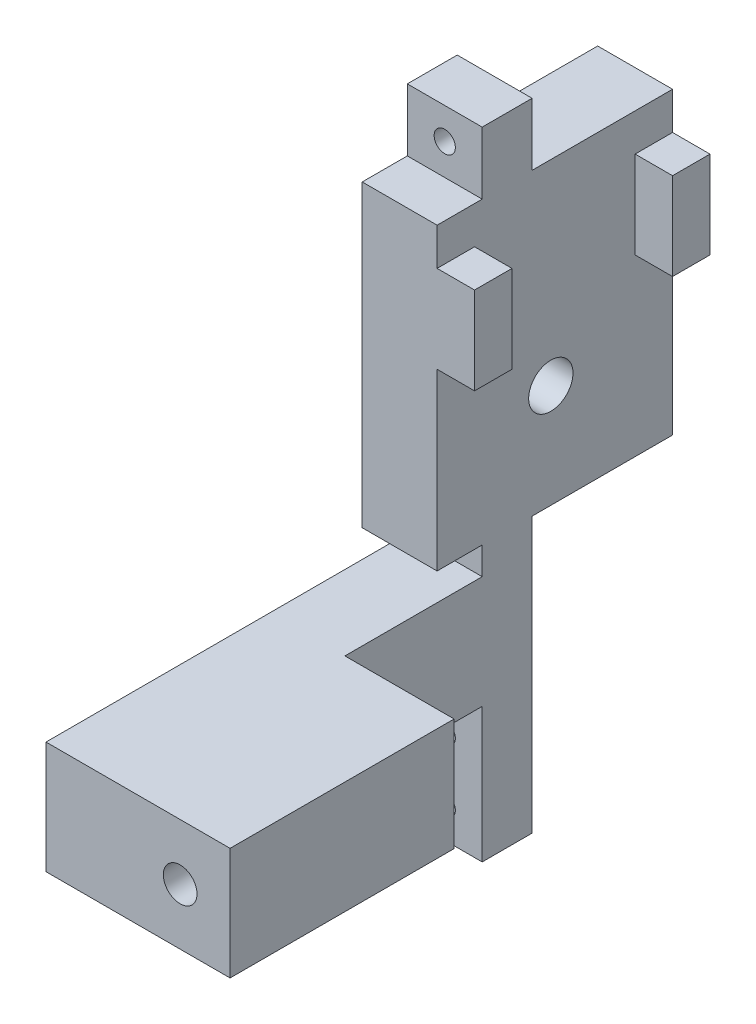
ISO-10303-21;
HEADER;
FILE_DESCRIPTION(('STEP AP214'),'2;1');
FILE_NAME('part.step','',(''),(''),'','','');
FILE_SCHEMA(('AUTOMOTIVE_DESIGN { 1 0 10303 214 1 1 1 1 }'));
ENDSEC;
DATA;
#1=APPLICATION_CONTEXT('core data for automotive mechanical design processes');
#2=APPLICATION_PROTOCOL_DEFINITION('international standard','automotive_design',2000,#1);
#3=PRODUCT_CONTEXT('',#1,'mechanical');
#4=PRODUCT('Part','Part','',(#3));
#5=PRODUCT_RELATED_PRODUCT_CATEGORY('part','',(#4));
#6=PRODUCT_DEFINITION_FORMATION('','',#4);
#7=PRODUCT_DEFINITION_CONTEXT('part definition',#1,'design');
#8=PRODUCT_DEFINITION('design','',#6,#7);
#9=PRODUCT_DEFINITION_SHAPE('','',#8);
#10=(LENGTH_UNIT() NAMED_UNIT(*) SI_UNIT(.MILLI.,.METRE.));
#11=(NAMED_UNIT(*) PLANE_ANGLE_UNIT() SI_UNIT($,.RADIAN.));
#12=(NAMED_UNIT(*) SI_UNIT($,.STERADIAN.) SOLID_ANGLE_UNIT());
#13=UNCERTAINTY_MEASURE_WITH_UNIT(LENGTH_MEASURE(1.E-05),#10,'distance_accuracy_value','');
#14=(GEOMETRIC_REPRESENTATION_CONTEXT(3) GLOBAL_UNCERTAINTY_ASSIGNED_CONTEXT((#13)) GLOBAL_UNIT_ASSIGNED_CONTEXT((#10,
#11,#12)) REPRESENTATION_CONTEXT('',''));
#15=CARTESIAN_POINT('',(0.,0.,0.));
#16=DIRECTION('',(0.,0.,1.));
#17=DIRECTION('',(1.,0.,0.));
#18=AXIS2_PLACEMENT_3D('',#15,#16,#17);
#19=CARTESIAN_POINT('',(-52.,50.6,60.905110294118));
#20=DIRECTION('',(0.,0.,1.));
#21=DIRECTION('',(1.,0.,0.));
#22=AXIS2_PLACEMENT_3D('',#19,#20,#21);
#23=PLANE('',#22);
#24=CARTESIAN_POINT('',(-52.,50.6,60.905110294118));
#25=DIRECTION('',(0.,0.,1.));
#26=DIRECTION('',(1.,0.,0.));
#27=AXIS2_PLACEMENT_3D('',#24,#25,#26);
#28=CIRCLE('',#27,2.7);
#29=CARTESIAN_POINT('',(-49.3,50.6,60.905110294118));
#30=VERTEX_POINT('',#29);
#31=EDGE_CURVE('E18',#30,#30,#28,.T.);
#32=ORIENTED_EDGE('',*,*,#31,.T.);
#33=EDGE_LOOP('',(#32));
#34=FACE_BOUND('',#33,.T.);
#35=CARTESIAN_POINT('',(-52.,50.6,60.905110294118));
#36=DIRECTION('',(0.,0.,1.));
#37=DIRECTION('',(1.,0.,0.));
#38=AXIS2_PLACEMENT_3D('',#35,#36,#37);
#39=CIRCLE('',#38,5.3);
#40=CARTESIAN_POINT('',(-46.7,50.6,60.905110294118));
#41=VERTEX_POINT('',#40);
#42=EDGE_CURVE('E9',#41,#41,#39,.T.);
#43=ORIENTED_EDGE('',*,*,#42,.F.);
#44=EDGE_LOOP('',(#43));
#45=FACE_BOUND('',#44,.T.);
#46=ADVANCED_FACE('F14',(#34,#45),#23,.F.);
#47=CARTESIAN_POINT('',(-52.,50.6,32.9));
#48=DIRECTION('',(0.,0.,1.));
#49=DIRECTION('',(1.,0.,0.));
#50=AXIS2_PLACEMENT_3D('',#47,#48,#49);
#51=CYLINDRICAL_SURFACE('',#50,5.3);
#52=CARTESIAN_POINT('',(-52.,50.6,33.));
#53=DIRECTION('',(0.,0.,1.));
#54=DIRECTION('',(1.,0.,0.));
#55=AXIS2_PLACEMENT_3D('',#52,#53,#54);
#56=CIRCLE('',#55,5.3);
#57=CARTESIAN_POINT('',(-46.7,50.6,33.));
#58=VERTEX_POINT('',#57);
#59=EDGE_CURVE('E356',#58,#58,#56,.T.);
#60=ORIENTED_EDGE('',*,*,#59,.F.);
#61=DIRECTION('',(0.,0.,1.));
#62=VECTOR('',#61,1.);
#63=CARTESIAN_POINT('',(-46.7,50.6,32.9));
#64=LINE('',#63,#62);
#65=EDGE_CURVE('E25',#58,#41,#64,.T.);
#66=ORIENTED_EDGE('',*,*,#65,.T.);
#67=ORIENTED_EDGE('',*,*,#42,.T.);
#68=ORIENTED_EDGE('',*,*,#65,.F.);
#69=EDGE_LOOP('',(#60,#66,#67,#68));
#70=FACE_BOUND('',#69,.T.);
#71=ADVANCED_FACE('F745',(#70),#51,.F.);
#72=CARTESIAN_POINT('',(-61.5,92.,12.225163258624));
#73=DIRECTION('',(0.,0.,1.));
#74=DIRECTION('',(1.,0.,0.));
#75=AXIS2_PLACEMENT_3D('',#72,#73,#74);
#76=PLANE('',#75);
#77=DIRECTION('',(1.,0.,0.));
#78=VECTOR('',#77,1.);
#79=CARTESIAN_POINT('',(-61.5,106.,12.225163258624));
#80=LINE('',#79,#78);
#81=CARTESIAN_POINT('',(-61.5,106.,12.225163258624));
#82=VERTEX_POINT('',#81);
#83=CARTESIAN_POINT('',(-55.5,106.,12.225163258624));
#84=VERTEX_POINT('',#83);
#85=EDGE_CURVE('E509',#82,#84,#80,.T.);
#86=ORIENTED_EDGE('',*,*,#85,.T.);
#87=DIRECTION('',(0.,1.,0.));
#88=VECTOR('',#87,1.);
#89=CARTESIAN_POINT('',(-55.5,92.,12.225163258624));
#90=LINE('',#89,#88);
#91=CARTESIAN_POINT('',(-55.5,92.,12.225163258624));
#92=VERTEX_POINT('',#91);
#93=EDGE_CURVE('E506',#92,#84,#90,.T.);
#94=ORIENTED_EDGE('',*,*,#93,.F.);
#95=DIRECTION('',(1.,0.,0.));
#96=VECTOR('',#95,1.);
#97=CARTESIAN_POINT('',(-61.5,92.,12.225163258624));
#98=LINE('',#97,#96);
#99=CARTESIAN_POINT('',(-61.5,92.,12.225163258624));
#100=VERTEX_POINT('',#99);
#101=EDGE_CURVE('E503',#100,#92,#98,.T.);
#102=ORIENTED_EDGE('',*,*,#101,.F.);
#103=DIRECTION('',(0.,1.,0.));
#104=VECTOR('',#103,1.);
#105=CARTESIAN_POINT('',(-61.5,92.,12.225163258624));
#106=LINE('',#105,#104);
#107=EDGE_CURVE('E447',#100,#82,#106,.T.);
#108=ORIENTED_EDGE('',*,*,#107,.T.);
#109=EDGE_LOOP('',(#86,#94,#102,#108));
#110=FACE_BOUND('',#109,.T.);
#111=ADVANCED_FACE('F751',(#110),#76,.F.);
#112=CARTESIAN_POINT('',(-61.5,92.,-13.50881257584));
#113=DIRECTION('',(0.,0.,1.));
#114=DIRECTION('',(1.,0.,0.));
#115=AXIS2_PLACEMENT_3D('',#112,#113,#114);
#116=PLANE('',#115);
#117=DIRECTION('',(0.,1.,0.));
#118=VECTOR('',#117,1.);
#119=CARTESIAN_POINT('',(-61.5,92.,-13.50881257584));
#120=LINE('',#119,#118);
#121=CARTESIAN_POINT('',(-61.5,92.,-13.50881257584));
#122=VERTEX_POINT('',#121);
#123=CARTESIAN_POINT('',(-61.5,106.,-13.50881257584));
#124=VERTEX_POINT('',#123);
#125=EDGE_CURVE('E528',#122,#124,#120,.T.);
#126=ORIENTED_EDGE('',*,*,#125,.F.);
#127=DIRECTION('',(1.,0.,0.));
#128=VECTOR('',#127,1.);
#129=CARTESIAN_POINT('',(-61.5,92.,-13.50881257584));
#130=LINE('',#129,#128);
#131=CARTESIAN_POINT('',(-55.5,92.,-13.50881257584));
#132=VERTEX_POINT('',#131);
#133=EDGE_CURVE('E403',#122,#132,#130,.T.);
#134=ORIENTED_EDGE('',*,*,#133,.T.);
#135=DIRECTION('',(0.,1.,0.));
#136=VECTOR('',#135,1.);
#137=CARTESIAN_POINT('',(-55.5,92.,-13.50881257584));
#138=LINE('',#137,#136);
#139=CARTESIAN_POINT('',(-55.5,106.,-13.50881257584));
#140=VERTEX_POINT('',#139);
#141=EDGE_CURVE('E347',#132,#140,#138,.T.);
#142=ORIENTED_EDGE('',*,*,#141,.T.);
#143=DIRECTION('',(1.,0.,0.));
#144=VECTOR('',#143,1.);
#145=CARTESIAN_POINT('',(-61.5,106.,-13.50881257584));
#146=LINE('',#145,#144);
#147=EDGE_CURVE('E351',#124,#140,#146,.T.);
#148=ORIENTED_EDGE('',*,*,#147,.F.);
#149=EDGE_LOOP('',(#126,#134,#142,#148));
#150=FACE_BOUND('',#149,.T.);
#151=ADVANCED_FACE('F527',(#150),#116,.T.);
#152=CARTESIAN_POINT('',(-61.5,106.,12.225163258624));
#153=DIRECTION('',(0.,1.,0.));
#154=DIRECTION('',(1.,0.,0.));
#155=AXIS2_PLACEMENT_3D('',#152,#153,#154);
#156=PLANE('',#155);
#157=ORIENTED_EDGE('',*,*,#85,.F.);
#158=DIRECTION('',(0.,0.,1.));
#159=VECTOR('',#158,1.);
#160=CARTESIAN_POINT('',(-61.5,106.,12.225163258624));
#161=LINE('',#160,#159);
#162=CARTESIAN_POINT('',(-61.5,106.,18.225163258624));
#163=VERTEX_POINT('',#162);
#164=EDGE_CURVE('E452',#82,#163,#161,.T.);
#165=ORIENTED_EDGE('',*,*,#164,.T.);
#166=DIRECTION('',(1.,0.,0.));
#167=VECTOR('',#166,1.);
#168=CARTESIAN_POINT('',(-61.5,106.,18.225163258624));
#169=LINE('',#168,#167);
#170=CARTESIAN_POINT('',(-55.5,106.,18.225163258624));
#171=VERTEX_POINT('',#170);
#172=EDGE_CURVE('E559',#163,#171,#169,.T.);
#173=ORIENTED_EDGE('',*,*,#172,.T.);
#174=DIRECTION('',(0.,0.,1.));
#175=VECTOR('',#174,1.);
#176=CARTESIAN_POINT('',(-55.5,106.,12.225163258624));
#177=LINE('',#176,#175);
#178=EDGE_CURVE('E238',#84,#171,#177,.T.);
#179=ORIENTED_EDGE('',*,*,#178,.F.);
#180=EDGE_LOOP('',(#157,#165,#173,#179));
#181=FACE_BOUND('',#180,.T.);
#182=ADVANCED_FACE('F784',(#181),#156,.T.);
#183=CARTESIAN_POINT('',(-55.5,92.,12.225163258624));
#184=DIRECTION('',(1.,0.,0.));
#185=DIRECTION('',(0.,1.,0.));
#186=AXIS2_PLACEMENT_3D('',#183,#184,#185);
#187=PLANE('',#186);
#188=DIRECTION('',(0.,0.,1.));
#189=VECTOR('',#188,1.);
#190=CARTESIAN_POINT('',(-55.5,92.,12.225163258624));
#191=LINE('',#190,#189);
#192=CARTESIAN_POINT('',(-55.5,92.,18.225163258624));
#193=VERTEX_POINT('',#192);
#194=EDGE_CURVE('E254',#92,#193,#191,.T.);
#195=ORIENTED_EDGE('',*,*,#194,.F.);
#196=ORIENTED_EDGE('',*,*,#93,.T.);
#197=ORIENTED_EDGE('',*,*,#178,.T.);
#198=DIRECTION('',(0.,1.,0.));
#199=VECTOR('',#198,1.);
#200=CARTESIAN_POINT('',(-55.5,92.,18.225163258624));
#201=LINE('',#200,#199);
#202=EDGE_CURVE('E577',#193,#171,#201,.T.);
#203=ORIENTED_EDGE('',*,*,#202,.F.);
#204=EDGE_LOOP('',(#195,#196,#197,#203));
#205=FACE_BOUND('',#204,.T.);
#206=ADVANCED_FACE('F781',(#205),#187,.T.);
#207=CARTESIAN_POINT('',(-61.5,92.,12.225163258624));
#208=DIRECTION('',(0.,1.,0.));
#209=DIRECTION('',(1.,0.,0.));
#210=AXIS2_PLACEMENT_3D('',#207,#208,#209);
#211=PLANE('',#210);
#212=ORIENTED_EDGE('',*,*,#194,.T.);
#213=DIRECTION('',(1.,0.,0.));
#214=VECTOR('',#213,1.);
#215=CARTESIAN_POINT('',(-61.5,92.,18.225163258624));
#216=LINE('',#215,#214);
#217=CARTESIAN_POINT('',(-61.5,92.,18.225163258624));
#218=VERTEX_POINT('',#217);
#219=EDGE_CURVE('E421',#218,#193,#216,.T.);
#220=ORIENTED_EDGE('',*,*,#219,.F.);
#221=DIRECTION('',(0.,0.,1.));
#222=VECTOR('',#221,1.);
#223=CARTESIAN_POINT('',(-61.5,92.,12.225163258624));
#224=LINE('',#223,#222);
#225=EDGE_CURVE('E451',#100,#218,#224,.T.);
#226=ORIENTED_EDGE('',*,*,#225,.F.);
#227=ORIENTED_EDGE('',*,*,#101,.T.);
#228=EDGE_LOOP('',(#212,#220,#226,#227));
#229=FACE_BOUND('',#228,.T.);
#230=ADVANCED_FACE('F769',(#229),#211,.F.);
#231=CARTESIAN_POINT('',(-67.5,117.,2.9));
#232=DIRECTION('',(0.,0.,1.));
#233=DIRECTION('',(1.,0.,0.));
#234=AXIS2_PLACEMENT_3D('',#231,#232,#233);
#235=CYLINDRICAL_SURFACE('',#234,1.7);
#236=DIRECTION('',(0.,0.,1.));
#237=VECTOR('',#236,1.);
#238=CARTESIAN_POINT('',(-65.8,117.,2.9));
#239=LINE('',#238,#237);
#240=CARTESIAN_POINT('',(-65.8,117.,3.));
#241=VERTEX_POINT('',#240);
#242=CARTESIAN_POINT('',(-65.8,117.,11.));
#243=VERTEX_POINT('',#242);
#244=EDGE_CURVE('E367',#241,#243,#239,.T.);
#245=ORIENTED_EDGE('',*,*,#244,.F.);
#246=CARTESIAN_POINT('',(-67.5,117.,3.));
#247=DIRECTION('',(0.,0.,1.));
#248=DIRECTION('',(1.,0.,0.));
#249=AXIS2_PLACEMENT_3D('',#246,#247,#248);
#250=CIRCLE('',#249,1.7);
#251=EDGE_CURVE('E371',#241,#241,#250,.T.);
#252=ORIENTED_EDGE('',*,*,#251,.F.);
#253=ORIENTED_EDGE('',*,*,#244,.T.);
#254=CARTESIAN_POINT('',(-67.5,117.,11.));
#255=DIRECTION('',(0.,0.,1.));
#256=DIRECTION('',(1.,0.,0.));
#257=AXIS2_PLACEMENT_3D('',#254,#255,#256);
#258=CIRCLE('',#257,1.7);
#259=EDGE_CURVE('E461',#243,#243,#258,.T.);
#260=ORIENTED_EDGE('',*,*,#259,.T.);
#261=EDGE_LOOP('',(#245,#252,#253,#260));
#262=FACE_BOUND('',#261,.T.);
#263=ADVANCED_FACE('F766',(#262),#235,.F.);
#264=CARTESIAN_POINT('',(-61.5,106.,-19.50881257584));
#265=DIRECTION('',(0.,1.,0.));
#266=DIRECTION('',(1.,0.,0.));
#267=AXIS2_PLACEMENT_3D('',#264,#265,#266);
#268=PLANE('',#267);
#269=DIRECTION('',(1.,0.,0.));
#270=VECTOR('',#269,1.);
#271=CARTESIAN_POINT('',(-61.5,106.,-19.50881257584));
#272=LINE('',#271,#270);
#273=CARTESIAN_POINT('',(-61.5,106.,-19.50881257584));
#274=VERTEX_POINT('',#273);
#275=CARTESIAN_POINT('',(-55.5,106.,-19.50881257584));
#276=VERTEX_POINT('',#275);
#277=EDGE_CURVE('E433',#274,#276,#272,.T.);
#278=ORIENTED_EDGE('',*,*,#277,.F.);
#279=DIRECTION('',(0.,0.,1.));
#280=VECTOR('',#279,1.);
#281=CARTESIAN_POINT('',(-61.5,106.,-19.50881257584));
#282=LINE('',#281,#280);
#283=EDGE_CURVE('E523',#274,#124,#282,.T.);
#284=ORIENTED_EDGE('',*,*,#283,.T.);
#285=ORIENTED_EDGE('',*,*,#147,.T.);
#286=DIRECTION('',(0.,0.,1.));
#287=VECTOR('',#286,1.);
#288=CARTESIAN_POINT('',(-55.5,106.,-19.50881257584));
#289=LINE('',#288,#287);
#290=EDGE_CURVE('E352',#276,#140,#289,.T.);
#291=ORIENTED_EDGE('',*,*,#290,.F.);
#292=EDGE_LOOP('',(#278,#284,#285,#291));
#293=FACE_BOUND('',#292,.T.);
#294=ADVANCED_FACE('F522',(#293),#268,.T.);
#295=CARTESIAN_POINT('',(-55.5,92.,-19.50881257584));
#296=DIRECTION('',(1.,0.,0.));
#297=DIRECTION('',(0.,1.,0.));
#298=AXIS2_PLACEMENT_3D('',#295,#296,#297);
#299=PLANE('',#298);
#300=DIRECTION('',(0.,0.,1.));
#301=VECTOR('',#300,1.);
#302=CARTESIAN_POINT('',(-55.5,92.,-19.50881257584));
#303=LINE('',#302,#301);
#304=CARTESIAN_POINT('',(-55.5,92.,-19.50881257584));
#305=VERTEX_POINT('',#304);
#306=EDGE_CURVE('E399',#305,#132,#303,.T.);
#307=ORIENTED_EDGE('',*,*,#306,.F.);
#308=DIRECTION('',(0.,1.,0.));
#309=VECTOR('',#308,1.);
#310=CARTESIAN_POINT('',(-55.5,92.,-19.50881257584));
#311=LINE('',#310,#309);
#312=EDGE_CURVE('E437',#305,#276,#311,.T.);
#313=ORIENTED_EDGE('',*,*,#312,.T.);
#314=ORIENTED_EDGE('',*,*,#290,.T.);
#315=ORIENTED_EDGE('',*,*,#141,.F.);
#316=EDGE_LOOP('',(#307,#313,#314,#315));
#317=FACE_BOUND('',#316,.T.);
#318=ADVANCED_FACE('F517',(#317),#299,.T.);
#319=CARTESIAN_POINT('',(-61.5,92.,-19.50881257584));
#320=DIRECTION('',(0.,1.,0.));
#321=DIRECTION('',(1.,0.,0.));
#322=AXIS2_PLACEMENT_3D('',#319,#320,#321);
#323=PLANE('',#322);
#324=ORIENTED_EDGE('',*,*,#306,.T.);
#325=ORIENTED_EDGE('',*,*,#133,.F.);
#326=DIRECTION('',(0.,0.,1.));
#327=VECTOR('',#326,1.);
#328=CARTESIAN_POINT('',(-61.5,92.,-19.50881257584));
#329=LINE('',#328,#327);
#330=CARTESIAN_POINT('',(-61.5,92.,-19.50881257584));
#331=VERTEX_POINT('',#330);
#332=EDGE_CURVE('E532',#331,#122,#329,.T.);
#333=ORIENTED_EDGE('',*,*,#332,.F.);
#334=DIRECTION('',(1.,0.,0.));
#335=VECTOR('',#334,1.);
#336=CARTESIAN_POINT('',(-61.5,92.,-19.50881257584));
#337=LINE('',#336,#335);
#338=EDGE_CURVE('E490',#331,#305,#337,.T.);
#339=ORIENTED_EDGE('',*,*,#338,.T.);
#340=EDGE_LOOP('',(#324,#325,#333,#339));
#341=FACE_BOUND('',#340,.T.);
#342=ADVANCED_FACE('F531',(#341),#323,.F.);
#343=CARTESIAN_POINT('',(-52.,50.6,60.805110294118));
#344=DIRECTION('',(0.,0.,1.));
#345=DIRECTION('',(1.,0.,0.));
#346=AXIS2_PLACEMENT_3D('',#343,#344,#345);
#347=CYLINDRICAL_SURFACE('',#346,2.7);
#348=DIRECTION('',(0.,0.,1.));
#349=VECTOR('',#348,1.);
#350=CARTESIAN_POINT('',(-49.3,50.6,60.805110294118));
#351=LINE('',#350,#349);
#352=CARTESIAN_POINT('',(-49.3,50.6,68.905110294118));
#353=VERTEX_POINT('',#352);
#354=EDGE_CURVE('E498',#30,#353,#351,.T.);
#355=ORIENTED_EDGE('',*,*,#354,.F.);
#356=ORIENTED_EDGE('',*,*,#31,.F.);
#357=ORIENTED_EDGE('',*,*,#354,.T.);
#358=CARTESIAN_POINT('',(-52.,50.6,68.905110294118));
#359=DIRECTION('',(0.,0.,1.));
#360=DIRECTION('',(1.,0.,0.));
#361=AXIS2_PLACEMENT_3D('',#358,#359,#360);
#362=CIRCLE('',#361,2.7);
#363=EDGE_CURVE('E360',#353,#353,#362,.T.);
#364=ORIENTED_EDGE('',*,*,#363,.T.);
#365=EDGE_LOOP('',(#355,#356,#357,#364));
#366=FACE_BOUND('',#365,.T.);
#367=ADVANCED_FACE('F780',(#366),#347,.F.);
#368=CARTESIAN_POINT('',(-61.5,41.6,33.));
#369=DIRECTION('',(0.,0.,1.));
#370=DIRECTION('',(1.,0.,0.));
#371=AXIS2_PLACEMENT_3D('',#368,#369,#370);
#372=PLANE('',#371);
#373=ORIENTED_EDGE('',*,*,#59,.T.);
#374=EDGE_LOOP('',(#373));
#375=FACE_BOUND('',#374,.T.);
#376=DIRECTION('',(1.,0.,0.));
#377=VECTOR('',#376,1.);
#378=CARTESIAN_POINT('',(-61.5,59.6,33.));
#379=LINE('',#378,#377);
#380=CARTESIAN_POINT('',(-61.5,59.6,33.));
#381=VERTEX_POINT('',#380);
#382=CARTESIAN_POINT('',(-44.,59.6,33.));
#383=VERTEX_POINT('',#382);
#384=EDGE_CURVE('E320',#381,#383,#379,.T.);
#385=ORIENTED_EDGE('',*,*,#384,.T.);
#386=DIRECTION('',(0.,1.,0.));
#387=VECTOR('',#386,1.);
#388=CARTESIAN_POINT('',(-44.,41.6,33.));
#389=LINE('',#388,#387);
#390=CARTESIAN_POINT('',(-44.,41.6,33.));
#391=VERTEX_POINT('',#390);
#392=EDGE_CURVE('E353',#391,#383,#389,.T.);
#393=ORIENTED_EDGE('',*,*,#392,.F.);
#394=DIRECTION('',(1.,0.,0.));
#395=VECTOR('',#394,1.);
#396=CARTESIAN_POINT('',(-61.5,41.6,33.));
#397=LINE('',#396,#395);
#398=CARTESIAN_POINT('',(-61.5,41.6,33.));
#399=VERTEX_POINT('',#398);
#400=EDGE_CURVE('E411',#399,#391,#397,.T.);
#401=ORIENTED_EDGE('',*,*,#400,.F.);
#402=DIRECTION('',(0.,1.,0.));
#403=VECTOR('',#402,1.);
#404=CARTESIAN_POINT('',(-61.5,41.6,33.));
#405=LINE('',#404,#403);
#406=EDGE_CURVE('E455',#399,#381,#405,.T.);
#407=ORIENTED_EDGE('',*,*,#406,.T.);
#408=EDGE_LOOP('',(#385,#393,#401,#407));
#409=FACE_BOUND('',#408,.T.);
#410=ADVANCED_FACE('F726',(#375,#409),#372,.F.);
#411=CARTESIAN_POINT('',(-44.,41.6,33.));
#412=DIRECTION('',(1.,0.,0.));
#413=DIRECTION('',(0.,1.,0.));
#414=AXIS2_PLACEMENT_3D('',#411,#412,#413);
#415=PLANE('',#414);
#416=DIRECTION('',(0.,0.,1.));
#417=VECTOR('',#416,1.);
#418=CARTESIAN_POINT('',(-44.,41.6,33.));
#419=LINE('',#418,#417);
#420=CARTESIAN_POINT('',(-44.,41.6,68.905110294118));
#421=VERTEX_POINT('',#420);
#422=EDGE_CURVE('E415',#391,#421,#419,.T.);
#423=ORIENTED_EDGE('',*,*,#422,.F.);
#424=ORIENTED_EDGE('',*,*,#392,.T.);
#425=DIRECTION('',(0.,0.,1.));
#426=VECTOR('',#425,1.);
#427=CARTESIAN_POINT('',(-44.,59.6,33.));
#428=LINE('',#427,#426);
#429=CARTESIAN_POINT('',(-44.,59.6,68.905110294118));
#430=VERTEX_POINT('',#429);
#431=EDGE_CURVE('E361',#383,#430,#428,.T.);
#432=ORIENTED_EDGE('',*,*,#431,.T.);
#433=DIRECTION('',(0.,1.,0.));
#434=VECTOR('',#433,1.);
#435=CARTESIAN_POINT('',(-44.,41.6,68.905110294118));
#436=LINE('',#435,#434);
#437=EDGE_CURVE('E488',#421,#430,#436,.T.);
#438=ORIENTED_EDGE('',*,*,#437,.F.);
#439=EDGE_LOOP('',(#423,#424,#432,#438));
#440=FACE_BOUND('',#439,.T.);
#441=ADVANCED_FACE('F724',(#440),#415,.T.);
#442=CARTESIAN_POINT('',(-67.5,35.,2.9));
#443=DIRECTION('',(0.,0.,1.));
#444=DIRECTION('',(1.,0.,0.));
#445=AXIS2_PLACEMENT_3D('',#442,#443,#444);
#446=CYLINDRICAL_SURFACE('',#445,1.7);
#447=DIRECTION('',(0.,0.,1.));
#448=VECTOR('',#447,1.);
#449=CARTESIAN_POINT('',(-65.8,35.,2.9));
#450=LINE('',#449,#448);
#451=CARTESIAN_POINT('',(-65.8,35.,3.));
#452=VERTEX_POINT('',#451);
#453=CARTESIAN_POINT('',(-65.8,35.,11.));
#454=VERTEX_POINT('',#453);
#455=EDGE_CURVE('E199',#452,#454,#450,.T.);
#456=ORIENTED_EDGE('',*,*,#455,.F.);
#457=CARTESIAN_POINT('',(-67.5,35.,3.));
#458=DIRECTION('',(0.,0.,1.));
#459=DIRECTION('',(1.,0.,0.));
#460=AXIS2_PLACEMENT_3D('',#457,#458,#459);
#461=CIRCLE('',#460,1.7);
#462=EDGE_CURVE('E484',#452,#452,#461,.T.);
#463=ORIENTED_EDGE('',*,*,#462,.F.);
#464=ORIENTED_EDGE('',*,*,#455,.T.);
#465=CARTESIAN_POINT('',(-67.5,35.,11.));
#466=DIRECTION('',(0.,0.,1.));
#467=DIRECTION('',(1.,0.,0.));
#468=AXIS2_PLACEMENT_3D('',#465,#466,#467);
#469=CIRCLE('',#468,1.7);
#470=EDGE_CURVE('E446',#454,#454,#469,.T.);
#471=ORIENTED_EDGE('',*,*,#470,.T.);
#472=EDGE_LOOP('',(#456,#463,#464,#471));
#473=FACE_BOUND('',#472,.T.);
#474=ADVANCED_FACE('F773',(#473),#446,.F.);
#475=CARTESIAN_POINT('',(-67.5,25.,2.9));
#476=DIRECTION('',(0.,0.,1.));
#477=DIRECTION('',(1.,0.,0.));
#478=AXIS2_PLACEMENT_3D('',#475,#476,#477);
#479=CYLINDRICAL_SURFACE('',#478,1.7);
#480=DIRECTION('',(0.,0.,1.));
#481=VECTOR('',#480,1.);
#482=CARTESIAN_POINT('',(-65.8,25.,2.9));
#483=LINE('',#482,#481);
#484=CARTESIAN_POINT('',(-65.8,25.,3.));
#485=VERTEX_POINT('',#484);
#486=CARTESIAN_POINT('',(-65.8,25.,11.));
#487=VERTEX_POINT('',#486);
#488=EDGE_CURVE('E213',#485,#487,#483,.T.);
#489=ORIENTED_EDGE('',*,*,#488,.F.);
#490=CARTESIAN_POINT('',(-67.5,25.,3.));
#491=DIRECTION('',(0.,0.,1.));
#492=DIRECTION('',(1.,0.,0.));
#493=AXIS2_PLACEMENT_3D('',#490,#491,#492);
#494=CIRCLE('',#493,1.7);
#495=EDGE_CURVE('E489',#485,#485,#494,.T.);
#496=ORIENTED_EDGE('',*,*,#495,.F.);
#497=ORIENTED_EDGE('',*,*,#488,.T.);
#498=CARTESIAN_POINT('',(-67.5,25.,11.));
#499=DIRECTION('',(0.,0.,1.));
#500=DIRECTION('',(1.,0.,0.));
#501=AXIS2_PLACEMENT_3D('',#498,#499,#500);
#502=CIRCLE('',#501,1.7);
#503=EDGE_CURVE('E394',#487,#487,#502,.T.);
#504=ORIENTED_EDGE('',*,*,#503,.T.);
#505=EDGE_LOOP('',(#489,#496,#497,#504));
#506=FACE_BOUND('',#505,.T.);
#507=ADVANCED_FACE('F707',(#506),#479,.F.);
#508=CARTESIAN_POINT('',(-61.5,20.,3.));
#509=DIRECTION('',(1.,0.,0.));
#510=DIRECTION('',(0.,1.,0.));
#511=AXIS2_PLACEMENT_3D('',#508,#509,#510);
#512=PLANE('',#511);
#513=CARTESIAN_POINT('',(-61.5,80.6,0.));
#514=DIRECTION('',(1.,0.,0.));
#515=DIRECTION('',(0.,0.,-1.));
#516=AXIS2_PLACEMENT_3D('',#513,#514,#515);
#517=CIRCLE('',#516,3.55);
#518=CARTESIAN_POINT('',(-61.5,80.6,-3.55));
#519=VERTEX_POINT('',#518);
#520=EDGE_CURVE('E586',#519,#519,#517,.T.);
#521=ORIENTED_EDGE('',*,*,#520,.F.);
#522=EDGE_LOOP('',(#521));
#523=FACE_BOUND('',#522,.T.);
#524=DIRECTION('',(0.,1.,0.));
#525=VECTOR('',#524,1.);
#526=CARTESIAN_POINT('',(-61.5,20.,11.));
#527=LINE('',#526,#525);
#528=CARTESIAN_POINT('',(-61.5,20.,11.));
#529=VERTEX_POINT('',#528);
#530=CARTESIAN_POINT('',(-61.5,41.6,11.));
#531=VERTEX_POINT('',#530);
#532=EDGE_CURVE('E395',#529,#531,#527,.T.);
#533=ORIENTED_EDGE('',*,*,#532,.F.);
#534=DIRECTION('',(0.,0.,1.));
#535=VECTOR('',#534,1.);
#536=CARTESIAN_POINT('',(-61.5,20.,3.));
#537=LINE('',#536,#535);
#538=CARTESIAN_POINT('',(-61.5,20.,3.));
#539=VERTEX_POINT('',#538);
#540=EDGE_CURVE('E443',#539,#529,#537,.T.);
#541=ORIENTED_EDGE('',*,*,#540,.F.);
#542=DIRECTION('',(0.,-1.,0.));
#543=VECTOR('',#542,1.);
#544=CARTESIAN_POINT('',(-61.5,122.,3.));
#545=LINE('',#544,#543);
#546=CARTESIAN_POINT('',(-61.5,64.,3.));
#547=VERTEX_POINT('',#546);
#548=EDGE_CURVE('E542',#547,#539,#545,.T.);
#549=ORIENTED_EDGE('',*,*,#548,.F.);
#550=DIRECTION('',(0.,0.,1.));
#551=VECTOR('',#550,1.);
#552=CARTESIAN_POINT('',(-61.5,64.,-19.50881257584));
#553=LINE('',#552,#551);
#554=CARTESIAN_POINT('',(-61.5,64.,-19.50881257584));
#555=VERTEX_POINT('',#554);
#556=EDGE_CURVE('E359',#555,#547,#553,.T.);
#557=ORIENTED_EDGE('',*,*,#556,.F.);
#558=DIRECTION('',(0.,1.,0.));
#559=VECTOR('',#558,1.);
#560=CARTESIAN_POINT('',(-61.5,64.,-19.50881257584));
#561=LINE('',#560,#559);
#562=EDGE_CURVE('E494',#555,#331,#561,.T.);
#563=ORIENTED_EDGE('',*,*,#562,.T.);
#564=ORIENTED_EDGE('',*,*,#332,.T.);
#565=ORIENTED_EDGE('',*,*,#125,.T.);
#566=ORIENTED_EDGE('',*,*,#283,.F.);
#567=DIRECTION('',(0.,1.,0.));
#568=VECTOR('',#567,1.);
#569=CARTESIAN_POINT('',(-61.5,64.,-19.50881257584));
#570=LINE('',#569,#568);
#571=CARTESIAN_POINT('',(-61.5,112.,-19.50881257584));
#572=VERTEX_POINT('',#571);
#573=EDGE_CURVE('E319',#274,#572,#570,.T.);
#574=ORIENTED_EDGE('',*,*,#573,.T.);
#575=DIRECTION('',(0.,0.,1.));
#576=VECTOR('',#575,1.);
#577=CARTESIAN_POINT('',(-61.5,112.,-19.50881257584));
#578=LINE('',#577,#576);
#579=CARTESIAN_POINT('',(-61.5,112.,3.));
#580=VERTEX_POINT('',#579);
#581=EDGE_CURVE('E314',#572,#580,#578,.T.);
#582=ORIENTED_EDGE('',*,*,#581,.T.);
#583=DIRECTION('',(0.,-1.,0.));
#584=VECTOR('',#583,1.);
#585=CARTESIAN_POINT('',(-61.5,122.,3.));
#586=LINE('',#585,#584);
#587=CARTESIAN_POINT('',(-61.5,122.,3.));
#588=VERTEX_POINT('',#587);
#589=EDGE_CURVE('E368',#588,#580,#586,.T.);
#590=ORIENTED_EDGE('',*,*,#589,.F.);
#591=DIRECTION('',(0.,0.,1.));
#592=VECTOR('',#591,1.);
#593=CARTESIAN_POINT('',(-61.5,122.,3.));
#594=LINE('',#593,#592);
#595=CARTESIAN_POINT('',(-61.5,122.,11.));
#596=VERTEX_POINT('',#595);
#597=EDGE_CURVE('E583',#588,#596,#594,.T.);
#598=ORIENTED_EDGE('',*,*,#597,.T.);
#599=DIRECTION('',(0.,1.,0.));
#600=VECTOR('',#599,1.);
#601=CARTESIAN_POINT('',(-61.5,20.,11.));
#602=LINE('',#601,#600);
#603=CARTESIAN_POINT('',(-61.5,112.,11.));
#604=VERTEX_POINT('',#603);
#605=EDGE_CURVE('E441',#604,#596,#602,.T.);
#606=ORIENTED_EDGE('',*,*,#605,.F.);
#607=DIRECTION('',(0.,0.,1.));
#608=VECTOR('',#607,1.);
#609=CARTESIAN_POINT('',(-61.5,112.,-19.50881257584));
#610=LINE('',#609,#608);
#611=CARTESIAN_POINT('',(-61.5,112.,18.225163258624));
#612=VERTEX_POINT('',#611);
#613=EDGE_CURVE('E442',#604,#612,#610,.T.);
#614=ORIENTED_EDGE('',*,*,#613,.T.);
#615=DIRECTION('',(0.,1.,0.));
#616=VECTOR('',#615,1.);
#617=CARTESIAN_POINT('',(-61.5,64.,18.225163258624));
#618=LINE('',#617,#616);
#619=EDGE_CURVE('E605',#163,#612,#618,.T.);
#620=ORIENTED_EDGE('',*,*,#619,.F.);
#621=ORIENTED_EDGE('',*,*,#164,.F.);
#622=ORIENTED_EDGE('',*,*,#107,.F.);
#623=ORIENTED_EDGE('',*,*,#225,.T.);
#624=DIRECTION('',(0.,1.,0.));
#625=VECTOR('',#624,1.);
#626=CARTESIAN_POINT('',(-61.5,64.,18.225163258624));
#627=LINE('',#626,#625);
#628=CARTESIAN_POINT('',(-61.5,64.,18.225163258624));
#629=VERTEX_POINT('',#628);
#630=EDGE_CURVE('E417',#629,#218,#627,.T.);
#631=ORIENTED_EDGE('',*,*,#630,.F.);
#632=DIRECTION('',(0.,0.,1.));
#633=VECTOR('',#632,1.);
#634=CARTESIAN_POINT('',(-61.5,64.,-19.50881257584));
#635=LINE('',#634,#633);
#636=CARTESIAN_POINT('',(-61.5,64.,11.));
#637=VERTEX_POINT('',#636);
#638=EDGE_CURVE('E616',#637,#629,#635,.T.);
#639=ORIENTED_EDGE('',*,*,#638,.F.);
#640=DIRECTION('',(0.,1.,0.));
#641=VECTOR('',#640,1.);
#642=CARTESIAN_POINT('',(-61.5,20.,11.));
#643=LINE('',#642,#641);
#644=CARTESIAN_POINT('',(-61.5,59.6,11.));
#645=VERTEX_POINT('',#644);
#646=EDGE_CURVE('E407',#645,#637,#643,.T.);
#647=ORIENTED_EDGE('',*,*,#646,.F.);
#648=DIRECTION('',(0.,0.,1.));
#649=VECTOR('',#648,1.);
#650=CARTESIAN_POINT('',(-61.5,59.6,3.));
#651=LINE('',#650,#649);
#652=EDGE_CURVE('E497',#645,#381,#651,.T.);
#653=ORIENTED_EDGE('',*,*,#652,.T.);
#654=ORIENTED_EDGE('',*,*,#406,.F.);
#655=DIRECTION('',(0.,0.,1.));
#656=VECTOR('',#655,1.);
#657=CARTESIAN_POINT('',(-61.5,41.6,3.));
#658=LINE('',#657,#656);
#659=EDGE_CURVE('E466',#531,#399,#658,.T.);
#660=ORIENTED_EDGE('',*,*,#659,.F.);
#661=EDGE_LOOP('',(#533,#541,#549,#557,#563,#564,#565,#566,#574,#582,#590,#598,#606,#614,#620,
#621,#622,#623,#631,#639,#647,#653,#654,#660));
#662=FACE_BOUND('',#661,.T.);
#663=ADVANCED_FACE('F540',(#523,#662),#512,.T.);
#664=CARTESIAN_POINT('',(-74.5,80.6,0.));
#665=DIRECTION('',(1.,0.,0.));
#666=DIRECTION('',(0.,0.,-1.));
#667=AXIS2_PLACEMENT_3D('',#664,#665,#666);
#668=CYLINDRICAL_SURFACE('',#667,3.55);
#669=DIRECTION('',(1.,0.,0.));
#670=VECTOR('',#669,1.);
#671=CARTESIAN_POINT('',(-74.5,80.6,-3.55));
#672=LINE('',#671,#670);
#673=CARTESIAN_POINT('',(-73.5,80.6,-3.55));
#674=VERTEX_POINT('',#673);
#675=EDGE_CURVE('E465',#674,#519,#672,.T.);
#676=ORIENTED_EDGE('',*,*,#675,.F.);
#677=CARTESIAN_POINT('',(-73.5,80.6,0.));
#678=DIRECTION('',(1.,0.,0.));
#679=DIRECTION('',(0.,0.,-1.));
#680=AXIS2_PLACEMENT_3D('',#677,#678,#679);
#681=CIRCLE('',#680,3.55);
#682=EDGE_CURVE('E429',#674,#674,#681,.T.);
#683=ORIENTED_EDGE('',*,*,#682,.F.);
#684=ORIENTED_EDGE('',*,*,#675,.T.);
#685=ORIENTED_EDGE('',*,*,#520,.T.);
#686=EDGE_LOOP('',(#676,#683,#684,#685));
#687=FACE_BOUND('',#686,.T.);
#688=ADVANCED_FACE('F944',(#687),#668,.F.);
#689=CARTESIAN_POINT('',(-73.5,20.,11.));
#690=DIRECTION('',(0.,0.,1.));
#691=DIRECTION('',(1.,0.,0.));
#692=AXIS2_PLACEMENT_3D('',#689,#690,#691);
#693=PLANE('',#692);
#694=ORIENTED_EDGE('',*,*,#259,.F.);
#695=EDGE_LOOP('',(#694));
#696=FACE_BOUND('',#695,.T.);
#697=DIRECTION('',(0.,1.,0.));
#698=VECTOR('',#697,1.);
#699=CARTESIAN_POINT('',(-73.5,20.,11.));
#700=LINE('',#699,#698);
#701=CARTESIAN_POINT('',(-73.5,112.,11.));
#702=VERTEX_POINT('',#701);
#703=CARTESIAN_POINT('',(-73.5,122.,11.));
#704=VERTEX_POINT('',#703);
#705=EDGE_CURVE('E476',#702,#704,#700,.T.);
#706=ORIENTED_EDGE('',*,*,#705,.F.);
#707=DIRECTION('',(-1.,0.,0.));
#708=VECTOR('',#707,1.);
#709=CARTESIAN_POINT('',(-73.5,112.,11.));
#710=LINE('',#709,#708);
#711=EDGE_CURVE('E438',#604,#702,#710,.T.);
#712=ORIENTED_EDGE('',*,*,#711,.F.);
#713=ORIENTED_EDGE('',*,*,#605,.T.);
#714=DIRECTION('',(1.,0.,0.));
#715=VECTOR('',#714,1.);
#716=CARTESIAN_POINT('',(-73.5,122.,11.));
#717=LINE('',#716,#715);
#718=EDGE_CURVE('E622',#704,#596,#717,.T.);
#719=ORIENTED_EDGE('',*,*,#718,.F.);
#720=EDGE_LOOP('',(#706,#712,#713,#719));
#721=FACE_BOUND('',#720,.T.);
#722=ADVANCED_FACE('F793',(#696,#721),#693,.T.);
#723=CARTESIAN_POINT('',(-73.5,112.,-19.50881257584));
#724=DIRECTION('',(0.,1.,0.));
#725=DIRECTION('',(1.,0.,0.));
#726=AXIS2_PLACEMENT_3D('',#723,#724,#725);
#727=PLANE('',#726);
#728=ORIENTED_EDGE('',*,*,#613,.F.);
#729=ORIENTED_EDGE('',*,*,#711,.T.);
#730=DIRECTION('',(0.,0.,1.));
#731=VECTOR('',#730,1.);
#732=CARTESIAN_POINT('',(-73.5,112.,-19.50881257584));
#733=LINE('',#732,#731);
#734=CARTESIAN_POINT('',(-73.5,112.,18.225163258624));
#735=VERTEX_POINT('',#734);
#736=EDGE_CURVE('E480',#702,#735,#733,.T.);
#737=ORIENTED_EDGE('',*,*,#736,.T.);
#738=DIRECTION('',(1.,0.,0.));
#739=VECTOR('',#738,1.);
#740=CARTESIAN_POINT('',(-73.5,112.,18.225163258624));
#741=LINE('',#740,#739);
#742=EDGE_CURVE('E609',#735,#612,#741,.T.);
#743=ORIENTED_EDGE('',*,*,#742,.T.);
#744=EDGE_LOOP('',(#728,#729,#737,#743));
#745=FACE_BOUND('',#744,.T.);
#746=ADVANCED_FACE('F791',(#745),#727,.T.);
#747=CARTESIAN_POINT('',(-73.5,122.,3.));
#748=DIRECTION('',(0.,1.,0.));
#749=DIRECTION('',(1.,0.,0.));
#750=AXIS2_PLACEMENT_3D('',#747,#748,#749);
#751=PLANE('',#750);
#752=DIRECTION('',(1.,0.,0.));
#753=VECTOR('',#752,1.);
#754=CARTESIAN_POINT('',(-73.5,122.,3.));
#755=LINE('',#754,#753);
#756=CARTESIAN_POINT('',(-73.5,122.,3.));
#757=VERTEX_POINT('',#756);
#758=EDGE_CURVE('E372',#757,#588,#755,.T.);
#759=ORIENTED_EDGE('',*,*,#758,.F.);
#760=DIRECTION('',(0.,0.,1.));
#761=VECTOR('',#760,1.);
#762=CARTESIAN_POINT('',(-73.5,122.,3.));
#763=LINE('',#762,#761);
#764=EDGE_CURVE('E343',#757,#704,#763,.T.);
#765=ORIENTED_EDGE('',*,*,#764,.T.);
#766=ORIENTED_EDGE('',*,*,#718,.T.);
#767=ORIENTED_EDGE('',*,*,#597,.F.);
#768=EDGE_LOOP('',(#759,#765,#766,#767));
#769=FACE_BOUND('',#768,.T.);
#770=ADVANCED_FACE('F16',(#769),#751,.T.);
#771=CARTESIAN_POINT('',(-73.5,64.,18.225163258624));
#772=DIRECTION('',(0.,0.,1.));
#773=DIRECTION('',(1.,0.,0.));
#774=AXIS2_PLACEMENT_3D('',#771,#772,#773);
#775=PLANE('',#774);
#776=DIRECTION('',(0.,1.,0.));
#777=VECTOR('',#776,1.);
#778=CARTESIAN_POINT('',(-73.5,64.,18.225163258624));
#779=LINE('',#778,#777);
#780=CARTESIAN_POINT('',(-73.5,64.,18.225163258624));
#781=VERTEX_POINT('',#780);
#782=EDGE_CURVE('E571',#781,#735,#779,.T.);
#783=ORIENTED_EDGE('',*,*,#782,.F.);
#784=DIRECTION('',(1.,0.,0.));
#785=VECTOR('',#784,1.);
#786=CARTESIAN_POINT('',(-73.5,64.,18.225163258624));
#787=LINE('',#786,#785);
#788=EDGE_CURVE('E382',#781,#629,#787,.T.);
#789=ORIENTED_EDGE('',*,*,#788,.T.);
#790=ORIENTED_EDGE('',*,*,#630,.T.);
#791=ORIENTED_EDGE('',*,*,#219,.T.);
#792=ORIENTED_EDGE('',*,*,#202,.T.);
#793=ORIENTED_EDGE('',*,*,#172,.F.);
#794=ORIENTED_EDGE('',*,*,#619,.T.);
#795=ORIENTED_EDGE('',*,*,#742,.F.);
#796=EDGE_LOOP('',(#783,#789,#790,#791,#792,#793,#794,#795));
#797=FACE_BOUND('',#796,.T.);
#798=ADVANCED_FACE('F759',(#797),#775,.T.);
#799=CARTESIAN_POINT('',(-73.5,20.,3.));
#800=DIRECTION('',(0.,0.,1.));
#801=DIRECTION('',(1.,0.,0.));
#802=AXIS2_PLACEMENT_3D('',#799,#800,#801);
#803=PLANE('',#802);
#804=ORIENTED_EDGE('',*,*,#251,.T.);
#805=EDGE_LOOP('',(#804));
#806=FACE_BOUND('',#805,.T.);
#807=DIRECTION('',(0.,-1.,0.));
#808=VECTOR('',#807,1.);
#809=CARTESIAN_POINT('',(-73.5,122.,3.));
#810=LINE('',#809,#808);
#811=CARTESIAN_POINT('',(-73.5,112.,3.));
#812=VERTEX_POINT('',#811);
#813=EDGE_CURVE('E337',#757,#812,#810,.T.);
#814=ORIENTED_EDGE('',*,*,#813,.F.);
#815=ORIENTED_EDGE('',*,*,#758,.T.);
#816=ORIENTED_EDGE('',*,*,#589,.T.);
#817=DIRECTION('',(-1.,0.,0.));
#818=VECTOR('',#817,1.);
#819=CARTESIAN_POINT('',(-73.5,112.,3.));
#820=LINE('',#819,#818);
#821=EDGE_CURVE('E379',#580,#812,#820,.T.);
#822=ORIENTED_EDGE('',*,*,#821,.T.);
#823=EDGE_LOOP('',(#814,#815,#816,#822));
#824=FACE_BOUND('',#823,.T.);
#825=ADVANCED_FACE('F762',(#806,#824),#803,.F.);
#826=CARTESIAN_POINT('',(-73.5,64.,-19.50881257584));
#827=DIRECTION('',(0.,1.,0.));
#828=DIRECTION('',(1.,0.,0.));
#829=AXIS2_PLACEMENT_3D('',#826,#827,#828);
#830=PLANE('',#829);
#831=ORIENTED_EDGE('',*,*,#788,.F.);
#832=DIRECTION('',(0.,0.,1.));
#833=VECTOR('',#832,1.);
#834=CARTESIAN_POINT('',(-73.5,64.,-19.50881257584));
#835=LINE('',#834,#833);
#836=CARTESIAN_POINT('',(-73.5,64.,11.));
#837=VERTEX_POINT('',#836);
#838=EDGE_CURVE('E567',#837,#781,#835,.T.);
#839=ORIENTED_EDGE('',*,*,#838,.F.);
#840=DIRECTION('',(-1.,0.,0.));
#841=VECTOR('',#840,1.);
#842=CARTESIAN_POINT('',(-73.5,64.,11.));
#843=LINE('',#842,#841);
#844=EDGE_CURVE('E404',#637,#837,#843,.T.);
#845=ORIENTED_EDGE('',*,*,#844,.F.);
#846=ORIENTED_EDGE('',*,*,#638,.T.);
#847=EDGE_LOOP('',(#831,#839,#845,#846));
#848=FACE_BOUND('',#847,.T.);
#849=ADVANCED_FACE('F672',(#848),#830,.F.);
#850=CARTESIAN_POINT('',(-73.5,112.,-19.50881257584));
#851=DIRECTION('',(0.,1.,0.));
#852=DIRECTION('',(1.,0.,0.));
#853=AXIS2_PLACEMENT_3D('',#850,#851,#852);
#854=PLANE('',#853);
#855=ORIENTED_EDGE('',*,*,#581,.F.);
#856=DIRECTION('',(1.,0.,0.));
#857=VECTOR('',#856,1.);
#858=CARTESIAN_POINT('',(-73.5,112.,-19.50881257584));
#859=LINE('',#858,#857);
#860=CARTESIAN_POINT('',(-73.5,112.,-19.50881257584));
#861=VERTEX_POINT('',#860);
#862=EDGE_CURVE('E306',#861,#572,#859,.T.);
#863=ORIENTED_EDGE('',*,*,#862,.F.);
#864=DIRECTION('',(0.,0.,1.));
#865=VECTOR('',#864,1.);
#866=CARTESIAN_POINT('',(-73.5,112.,-19.50881257584));
#867=LINE('',#866,#865);
#868=EDGE_CURVE('E311',#861,#812,#867,.T.);
#869=ORIENTED_EDGE('',*,*,#868,.T.);
#870=ORIENTED_EDGE('',*,*,#821,.F.);
#871=EDGE_LOOP('',(#855,#863,#869,#870));
#872=FACE_BOUND('',#871,.T.);
#873=ADVANCED_FACE('F308',(#872),#854,.T.);
#874=CARTESIAN_POINT('',(-73.5,20.,11.));
#875=DIRECTION('',(0.,0.,1.));
#876=DIRECTION('',(1.,0.,0.));
#877=AXIS2_PLACEMENT_3D('',#874,#875,#876);
#878=PLANE('',#877);
#879=DIRECTION('',(0.,1.,0.));
#880=VECTOR('',#879,1.);
#881=CARTESIAN_POINT('',(-73.5,20.,11.));
#882=LINE('',#881,#880);
#883=CARTESIAN_POINT('',(-73.5,59.6,11.));
#884=VERTEX_POINT('',#883);
#885=EDGE_CURVE('E387',#884,#837,#882,.T.);
#886=ORIENTED_EDGE('',*,*,#885,.F.);
#887=DIRECTION('',(-1.,0.,0.));
#888=VECTOR('',#887,1.);
#889=CARTESIAN_POINT('',(-73.5,59.6,11.));
#890=LINE('',#889,#888);
#891=EDGE_CURVE('E364',#645,#884,#890,.T.);
#892=ORIENTED_EDGE('',*,*,#891,.F.);
#893=ORIENTED_EDGE('',*,*,#646,.T.);
#894=ORIENTED_EDGE('',*,*,#844,.T.);
#895=EDGE_LOOP('',(#886,#892,#893,#894));
#896=FACE_BOUND('',#895,.T.);
#897=ADVANCED_FACE('F667',(#896),#878,.T.);
#898=CARTESIAN_POINT('',(-73.5,64.,-19.50881257584));
#899=DIRECTION('',(0.,0.,1.));
#900=DIRECTION('',(1.,0.,0.));
#901=AXIS2_PLACEMENT_3D('',#898,#899,#900);
#902=PLANE('',#901);
#903=ORIENTED_EDGE('',*,*,#862,.T.);
#904=ORIENTED_EDGE('',*,*,#573,.F.);
#905=ORIENTED_EDGE('',*,*,#277,.T.);
#906=ORIENTED_EDGE('',*,*,#312,.F.);
#907=ORIENTED_EDGE('',*,*,#338,.F.);
#908=ORIENTED_EDGE('',*,*,#562,.F.);
#909=DIRECTION('',(1.,0.,0.));
#910=VECTOR('',#909,1.);
#911=CARTESIAN_POINT('',(-73.5,64.,-19.50881257584));
#912=LINE('',#911,#910);
#913=CARTESIAN_POINT('',(-73.5,64.,-19.50881257584));
#914=VERTEX_POINT('',#913);
#915=EDGE_CURVE('E326',#914,#555,#912,.T.);
#916=ORIENTED_EDGE('',*,*,#915,.F.);
#917=DIRECTION('',(0.,1.,0.));
#918=VECTOR('',#917,1.);
#919=CARTESIAN_POINT('',(-73.5,64.,-19.50881257584));
#920=LINE('',#919,#918);
#921=EDGE_CURVE('E323',#914,#861,#920,.T.);
#922=ORIENTED_EDGE('',*,*,#921,.T.);
#923=EDGE_LOOP('',(#903,#904,#905,#906,#907,#908,#916,#922));
#924=FACE_BOUND('',#923,.T.);
#925=ADVANCED_FACE('F324',(#924),#902,.F.);
#926=CARTESIAN_POINT('',(-73.5,59.6,3.));
#927=DIRECTION('',(0.,1.,0.));
#928=DIRECTION('',(1.,0.,0.));
#929=AXIS2_PLACEMENT_3D('',#926,#927,#928);
#930=PLANE('',#929);
#931=ORIENTED_EDGE('',*,*,#652,.F.);
#932=ORIENTED_EDGE('',*,*,#891,.T.);
#933=DIRECTION('',(0.,0.,1.));
#934=VECTOR('',#933,1.);
#935=CARTESIAN_POINT('',(-73.5,59.6,3.));
#936=LINE('',#935,#934);
#937=CARTESIAN_POINT('',(-73.5,59.6,68.905110294118));
#938=VERTEX_POINT('',#937);
#939=EDGE_CURVE('E383',#884,#938,#936,.T.);
#940=ORIENTED_EDGE('',*,*,#939,.T.);
#941=DIRECTION('',(1.,0.,0.));
#942=VECTOR('',#941,1.);
#943=CARTESIAN_POINT('',(-73.5,59.6,68.905110294118));
#944=LINE('',#943,#942);
#945=EDGE_CURVE('E475',#938,#430,#944,.T.);
#946=ORIENTED_EDGE('',*,*,#945,.T.);
#947=ORIENTED_EDGE('',*,*,#431,.F.);
#948=ORIENTED_EDGE('',*,*,#384,.F.);
#949=EDGE_LOOP('',(#931,#932,#940,#946,#947,#948));
#950=FACE_BOUND('',#949,.T.);
#951=ADVANCED_FACE('F678',(#950),#930,.T.);
#952=CARTESIAN_POINT('',(-73.5,64.,-19.50881257584));
#953=DIRECTION('',(0.,1.,0.));
#954=DIRECTION('',(1.,0.,0.));
#955=AXIS2_PLACEMENT_3D('',#952,#953,#954);
#956=PLANE('',#955);
#957=DIRECTION('',(-1.,0.,0.));
#958=VECTOR('',#957,1.);
#959=CARTESIAN_POINT('',(-73.5,64.,3.));
#960=LINE('',#959,#958);
#961=CARTESIAN_POINT('',(-73.5,64.,3.));
#962=VERTEX_POINT('',#961);
#963=EDGE_CURVE('E470',#547,#962,#960,.T.);
#964=ORIENTED_EDGE('',*,*,#963,.T.);
#965=DIRECTION('',(0.,0.,1.));
#966=VECTOR('',#965,1.);
#967=CARTESIAN_POINT('',(-73.5,64.,-19.50881257584));
#968=LINE('',#967,#966);
#969=EDGE_CURVE('E331',#914,#962,#968,.T.);
#970=ORIENTED_EDGE('',*,*,#969,.F.);
#971=ORIENTED_EDGE('',*,*,#915,.T.);
#972=ORIENTED_EDGE('',*,*,#556,.T.);
#973=EDGE_LOOP('',(#964,#970,#971,#972));
#974=FACE_BOUND('',#973,.T.);
#975=ADVANCED_FACE('F545',(#974),#956,.F.);
#976=CARTESIAN_POINT('',(-73.5,41.6,68.905110294118));
#977=DIRECTION('',(0.,0.,1.));
#978=DIRECTION('',(1.,0.,0.));
#979=AXIS2_PLACEMENT_3D('',#976,#977,#978);
#980=PLANE('',#979);
#981=ORIENTED_EDGE('',*,*,#363,.F.);
#982=EDGE_LOOP('',(#981));
#983=FACE_BOUND('',#982,.T.);
#984=DIRECTION('',(0.,1.,0.));
#985=VECTOR('',#984,1.);
#986=CARTESIAN_POINT('',(-73.5,41.6,68.905110294118));
#987=LINE('',#986,#985);
#988=CARTESIAN_POINT('',(-73.5,41.6,68.905110294118));
#989=VERTEX_POINT('',#988);
#990=EDGE_CURVE('E388',#989,#938,#987,.T.);
#991=ORIENTED_EDGE('',*,*,#990,.F.);
#992=DIRECTION('',(1.,0.,0.));
#993=VECTOR('',#992,1.);
#994=CARTESIAN_POINT('',(-73.5,41.6,68.905110294118));
#995=LINE('',#994,#993);
#996=EDGE_CURVE('E471',#989,#421,#995,.T.);
#997=ORIENTED_EDGE('',*,*,#996,.T.);
#998=ORIENTED_EDGE('',*,*,#437,.T.);
#999=ORIENTED_EDGE('',*,*,#945,.F.);
#1000=EDGE_LOOP('',(#991,#997,#998,#999));
#1001=FACE_BOUND('',#1000,.T.);
#1002=ADVANCED_FACE('F722',(#983,#1001),#980,.T.);
#1003=CARTESIAN_POINT('',(-73.5,20.,3.));
#1004=DIRECTION('',(0.,0.,1.));
#1005=DIRECTION('',(1.,0.,0.));
#1006=AXIS2_PLACEMENT_3D('',#1003,#1004,#1005);
#1007=PLANE('',#1006);
#1008=ORIENTED_EDGE('',*,*,#462,.T.);
#1009=EDGE_LOOP('',(#1008));
#1010=FACE_BOUND('',#1009,.T.);
#1011=ORIENTED_EDGE('',*,*,#495,.T.);
#1012=EDGE_LOOP('',(#1011));
#1013=FACE_BOUND('',#1012,.T.);
#1014=DIRECTION('',(0.,-1.,0.));
#1015=VECTOR('',#1014,1.);
#1016=CARTESIAN_POINT('',(-73.5,122.,3.));
#1017=LINE('',#1016,#1015);
#1018=CARTESIAN_POINT('',(-73.5,20.,3.));
#1019=VERTEX_POINT('',#1018);
#1020=EDGE_CURVE('E378',#962,#1019,#1017,.T.);
#1021=ORIENTED_EDGE('',*,*,#1020,.F.);
#1022=ORIENTED_EDGE('',*,*,#963,.F.);
#1023=ORIENTED_EDGE('',*,*,#548,.T.);
#1024=DIRECTION('',(1.,0.,0.));
#1025=VECTOR('',#1024,1.);
#1026=CARTESIAN_POINT('',(-73.5,20.,3.));
#1027=LINE('',#1026,#1025);
#1028=EDGE_CURVE('E416',#1019,#539,#1027,.T.);
#1029=ORIENTED_EDGE('',*,*,#1028,.F.);
#1030=EDGE_LOOP('',(#1021,#1022,#1023,#1029));
#1031=FACE_BOUND('',#1030,.T.);
#1032=ADVANCED_FACE('F729',(#1010,#1013,#1031),#1007,.F.);
#1033=CARTESIAN_POINT('',(-73.5,41.6,3.));
#1034=DIRECTION('',(0.,1.,0.));
#1035=DIRECTION('',(1.,0.,0.));
#1036=AXIS2_PLACEMENT_3D('',#1033,#1034,#1035);
#1037=PLANE('',#1036);
#1038=ORIENTED_EDGE('',*,*,#400,.T.);
#1039=ORIENTED_EDGE('',*,*,#422,.T.);
#1040=ORIENTED_EDGE('',*,*,#996,.F.);
#1041=DIRECTION('',(0.,0.,1.));
#1042=VECTOR('',#1041,1.);
#1043=CARTESIAN_POINT('',(-73.5,41.6,3.));
#1044=LINE('',#1043,#1042);
#1045=CARTESIAN_POINT('',(-73.5,41.6,11.));
#1046=VERTEX_POINT('',#1045);
#1047=EDGE_CURVE('E430',#1046,#989,#1044,.T.);
#1048=ORIENTED_EDGE('',*,*,#1047,.F.);
#1049=DIRECTION('',(-1.,0.,0.));
#1050=VECTOR('',#1049,1.);
#1051=CARTESIAN_POINT('',(-73.5,41.6,11.));
#1052=LINE('',#1051,#1050);
#1053=EDGE_CURVE('E391',#531,#1046,#1052,.T.);
#1054=ORIENTED_EDGE('',*,*,#1053,.F.);
#1055=ORIENTED_EDGE('',*,*,#659,.T.);
#1056=EDGE_LOOP('',(#1038,#1039,#1040,#1048,#1054,#1055));
#1057=FACE_BOUND('',#1056,.T.);
#1058=ADVANCED_FACE('F719',(#1057),#1037,.F.);
#1059=CARTESIAN_POINT('',(-73.5,20.,3.));
#1060=DIRECTION('',(0.,1.,0.));
#1061=DIRECTION('',(1.,0.,0.));
#1062=AXIS2_PLACEMENT_3D('',#1059,#1060,#1061);
#1063=PLANE('',#1062);
#1064=ORIENTED_EDGE('',*,*,#540,.T.);
#1065=DIRECTION('',(1.,0.,0.));
#1066=VECTOR('',#1065,1.);
#1067=CARTESIAN_POINT('',(-73.5,20.,11.));
#1068=LINE('',#1067,#1066);
#1069=CARTESIAN_POINT('',(-73.5,20.,11.));
#1070=VERTEX_POINT('',#1069);
#1071=EDGE_CURVE('E425',#1070,#529,#1068,.T.);
#1072=ORIENTED_EDGE('',*,*,#1071,.F.);
#1073=DIRECTION('',(0.,0.,1.));
#1074=VECTOR('',#1073,1.);
#1075=CARTESIAN_POINT('',(-73.5,20.,3.));
#1076=LINE('',#1075,#1074);
#1077=EDGE_CURVE('E373',#1019,#1070,#1076,.T.);
#1078=ORIENTED_EDGE('',*,*,#1077,.F.);
#1079=ORIENTED_EDGE('',*,*,#1028,.T.);
#1080=EDGE_LOOP('',(#1064,#1072,#1078,#1079));
#1081=FACE_BOUND('',#1080,.T.);
#1082=ADVANCED_FACE('F712',(#1081),#1063,.F.);
#1083=CARTESIAN_POINT('',(-73.5,20.,11.));
#1084=DIRECTION('',(0.,0.,1.));
#1085=DIRECTION('',(1.,0.,0.));
#1086=AXIS2_PLACEMENT_3D('',#1083,#1084,#1085);
#1087=PLANE('',#1086);
#1088=ORIENTED_EDGE('',*,*,#470,.F.);
#1089=EDGE_LOOP('',(#1088));
#1090=FACE_BOUND('',#1089,.T.);
#1091=ORIENTED_EDGE('',*,*,#503,.F.);
#1092=EDGE_LOOP('',(#1091));
#1093=FACE_BOUND('',#1092,.T.);
#1094=DIRECTION('',(0.,1.,0.));
#1095=VECTOR('',#1094,1.);
#1096=CARTESIAN_POINT('',(-73.5,20.,11.));
#1097=LINE('',#1096,#1095);
#1098=EDGE_CURVE('E377',#1070,#1046,#1097,.T.);
#1099=ORIENTED_EDGE('',*,*,#1098,.F.);
#1100=ORIENTED_EDGE('',*,*,#1071,.T.);
#1101=ORIENTED_EDGE('',*,*,#532,.T.);
#1102=ORIENTED_EDGE('',*,*,#1053,.T.);
#1103=EDGE_LOOP('',(#1099,#1100,#1101,#1102));
#1104=FACE_BOUND('',#1103,.T.);
#1105=ADVANCED_FACE('F709',(#1090,#1093,#1104),#1087,.T.);
#1106=CARTESIAN_POINT('',(-73.5,20.,3.));
#1107=DIRECTION('',(1.,0.,0.));
#1108=DIRECTION('',(0.,1.,0.));
#1109=AXIS2_PLACEMENT_3D('',#1106,#1107,#1108);
#1110=PLANE('',#1109);
#1111=ORIENTED_EDGE('',*,*,#682,.T.);
#1112=EDGE_LOOP('',(#1111));
#1113=FACE_BOUND('',#1112,.T.);
#1114=ORIENTED_EDGE('',*,*,#1047,.T.);
#1115=ORIENTED_EDGE('',*,*,#990,.T.);
#1116=ORIENTED_EDGE('',*,*,#939,.F.);
#1117=ORIENTED_EDGE('',*,*,#885,.T.);
#1118=ORIENTED_EDGE('',*,*,#838,.T.);
#1119=ORIENTED_EDGE('',*,*,#782,.T.);
#1120=ORIENTED_EDGE('',*,*,#736,.F.);
#1121=ORIENTED_EDGE('',*,*,#705,.T.);
#1122=ORIENTED_EDGE('',*,*,#764,.F.);
#1123=ORIENTED_EDGE('',*,*,#813,.T.);
#1124=ORIENTED_EDGE('',*,*,#868,.F.);
#1125=ORIENTED_EDGE('',*,*,#921,.F.);
#1126=ORIENTED_EDGE('',*,*,#969,.T.);
#1127=ORIENTED_EDGE('',*,*,#1020,.T.);
#1128=ORIENTED_EDGE('',*,*,#1077,.T.);
#1129=ORIENTED_EDGE('',*,*,#1098,.T.);
#1130=EDGE_LOOP('',(#1114,#1115,#1116,#1117,#1118,#1119,#1120,#1121,#1122,#1123,#1124,#1125,
#1126,#1127,#1128,#1129));
#1131=FACE_BOUND('',#1130,.T.);
#1132=ADVANCED_FACE('F334',(#1113,#1131),#1110,.F.);
#1133=CLOSED_SHELL('',(#46,#71,#111,#151,#182,#206,#230,#263,#294,#318,#342,#367,#410,#441,#474,
#507,#663,#688,#722,#746,#770,#798,#825,#849,#873,#897,#925,#951,#975,#1002,#1032,#1058,#1082,
#1105,#1132));
#1134=MANIFOLD_SOLID_BREP('B1',#1133);
#1135=ADVANCED_BREP_SHAPE_REPRESENTATION('',(#18,#1134),#14);
#1136=SHAPE_DEFINITION_REPRESENTATION(#9,#1135);
ENDSEC;
END-ISO-10303-21;
